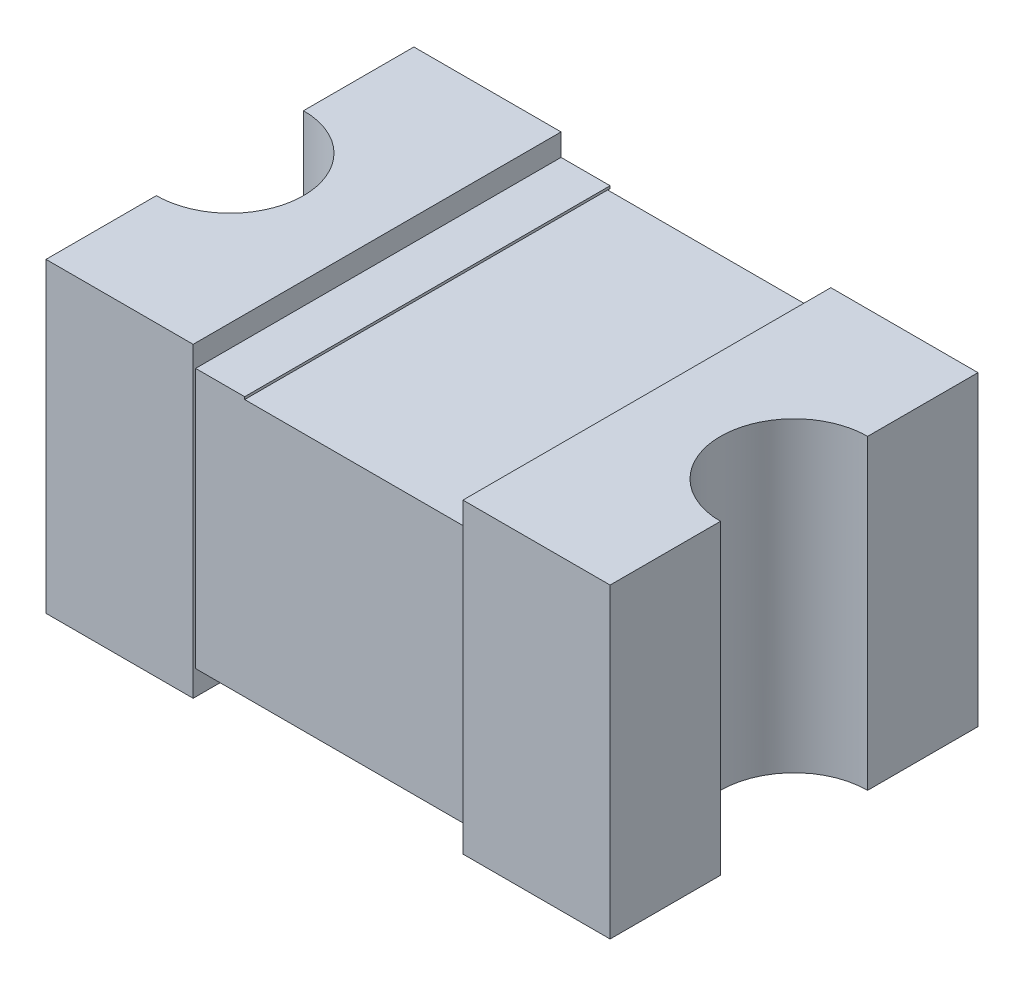
ISO-10303-21;
HEADER;
FILE_DESCRIPTION(('STEP AP214'),'2;1');
FILE_NAME('part.step','',(''),(''),'','','');
FILE_SCHEMA(('AUTOMOTIVE_DESIGN { 1 0 10303 214 1 1 1 1 }'));
ENDSEC;
DATA;
#1=APPLICATION_CONTEXT('core data for automotive mechanical design processes');
#2=APPLICATION_PROTOCOL_DEFINITION('international standard','automotive_design',2000,#1);
#3=PRODUCT_CONTEXT('',#1,'mechanical');
#4=PRODUCT('Part','Part','',(#3));
#5=PRODUCT_RELATED_PRODUCT_CATEGORY('part','',(#4));
#6=PRODUCT_DEFINITION_FORMATION('','',#4);
#7=PRODUCT_DEFINITION_CONTEXT('part definition',#1,'design');
#8=PRODUCT_DEFINITION('design','',#6,#7);
#9=PRODUCT_DEFINITION_SHAPE('','',#8);
#10=(LENGTH_UNIT() NAMED_UNIT(*) SI_UNIT(.MILLI.,.METRE.));
#11=(NAMED_UNIT(*) PLANE_ANGLE_UNIT() SI_UNIT($,.RADIAN.));
#12=(NAMED_UNIT(*) SI_UNIT($,.STERADIAN.) SOLID_ANGLE_UNIT());
#13=UNCERTAINTY_MEASURE_WITH_UNIT(LENGTH_MEASURE(1.E-05),#10,'distance_accuracy_value','');
#14=(GEOMETRIC_REPRESENTATION_CONTEXT(3) GLOBAL_UNCERTAINTY_ASSIGNED_CONTEXT((#13)) GLOBAL_UNIT_ASSIGNED_CONTEXT((#10,
#11,#12)) REPRESENTATION_CONTEXT('',''));
#15=CARTESIAN_POINT('',(0.,0.,0.));
#16=DIRECTION('',(0.,0.,1.));
#17=DIRECTION('',(1.,0.,0.));
#18=AXIS2_PLACEMENT_3D('',#15,#16,#17);
#19=CARTESIAN_POINT('',(-1.15,1.25,-0.75));
#20=DIRECTION('',(1.,0.,0.));
#21=DIRECTION('',(0.,0.,-1.));
#22=AXIS2_PLACEMENT_3D('',#19,#20,#21);
#23=PLANE('',#22);
#24=DIRECTION('',(0.,1.,0.));
#25=VECTOR('',#24,1.);
#26=CARTESIAN_POINT('',(-1.15,0.,-0.3));
#27=LINE('',#26,#25);
#28=CARTESIAN_POINT('',(-1.15,0.,-0.3));
#29=VERTEX_POINT('',#28);
#30=CARTESIAN_POINT('',(-1.15,1.25,-0.3));
#31=VERTEX_POINT('',#30);
#32=EDGE_CURVE('E152',#29,#31,#27,.T.);
#33=ORIENTED_EDGE('',*,*,#32,.T.);
#34=DIRECTION('',(0.,0.,1.));
#35=VECTOR('',#34,1.);
#36=CARTESIAN_POINT('',(-1.15,1.25,0.75));
#37=LINE('',#36,#35);
#38=CARTESIAN_POINT('',(-1.15,1.25,-0.75));
#39=VERTEX_POINT('',#38);
#40=EDGE_CURVE('E155',#39,#31,#37,.T.);
#41=ORIENTED_EDGE('',*,*,#40,.F.);
#42=DIRECTION('',(0.,1.,0.));
#43=VECTOR('',#42,1.);
#44=CARTESIAN_POINT('',(-1.15,1.25,-0.75));
#45=LINE('',#44,#43);
#46=CARTESIAN_POINT('',(-1.15,0.,-0.75));
#47=VERTEX_POINT('',#46);
#48=EDGE_CURVE('E420',#39,#47,#45,.F.);
#49=ORIENTED_EDGE('',*,*,#48,.T.);
#50=DIRECTION('',(0.,0.,1.));
#51=VECTOR('',#50,1.);
#52=CARTESIAN_POINT('',(-1.15,0.,0.75));
#53=LINE('',#52,#51);
#54=EDGE_CURVE('E158',#47,#29,#53,.T.);
#55=ORIENTED_EDGE('',*,*,#54,.T.);
#56=EDGE_LOOP('',(#33,#41,#49,#55));
#57=FACE_BOUND('',#56,.T.);
#58=ADVANCED_FACE('F17',(#57),#23,.F.);
#59=CARTESIAN_POINT('',(-1.15,0.,0.));
#60=DIRECTION('',(0.,1.,0.));
#61=DIRECTION('',(0.,0.,1.));
#62=AXIS2_PLACEMENT_3D('',#59,#60,#61);
#63=CYLINDRICAL_SURFACE('',#62,0.3);
#64=ORIENTED_EDGE('',*,*,#32,.F.);
#65=CARTESIAN_POINT('',(-1.15,0.,0.));
#66=DIRECTION('',(0.,-1.,0.));
#67=DIRECTION('',(0.,0.,-1.));
#68=AXIS2_PLACEMENT_3D('',#65,#66,#67);
#69=CIRCLE('',#68,0.3);
#70=CARTESIAN_POINT('',(-1.15,0.,0.3));
#71=VERTEX_POINT('',#70);
#72=EDGE_CURVE('E190',#29,#71,#69,.T.);
#73=ORIENTED_EDGE('',*,*,#72,.T.);
#74=DIRECTION('',(0.,1.,0.));
#75=VECTOR('',#74,1.);
#76=CARTESIAN_POINT('',(-1.15,1.25,0.3));
#77=LINE('',#76,#75);
#78=CARTESIAN_POINT('',(-1.15,1.25,0.3));
#79=VERTEX_POINT('',#78);
#80=EDGE_CURVE('E161',#71,#79,#77,.T.);
#81=ORIENTED_EDGE('',*,*,#80,.T.);
#82=CARTESIAN_POINT('',(-1.15,1.25,-0.3));
#83=CARTESIAN_POINT('',(-1.09304555927541,1.25,-0.3));
#84=CARTESIAN_POINT('',(-1.03957158713144,1.25,-0.27893649031873));
#85=CARTESIAN_POINT('',(-0.982253929764885,1.25,-0.25635894497391));
#86=CARTESIAN_POINT('',(-0.937867965644035,1.25,-0.212132034355964));
#87=CARTESIAN_POINT('',(-0.894228528229855,1.25,-0.168648975326774));
#88=CARTESIAN_POINT('',(-0.87106350968127,1.25,-0.110428412868562));
#89=CARTESIAN_POINT('',(-0.85010215683156,1.25,-0.057746315928485));
#90=CARTESIAN_POINT('',(-0.85,1.25,0.));
#91=CARTESIAN_POINT('',(-0.84989969452912,1.25,0.056699795034654));
#92=CARTESIAN_POINT('',(-0.87106350968127,1.25,0.110428412868562));
#93=CARTESIAN_POINT('',(-0.89364105502611,1.25,0.167746070235134));
#94=CARTESIAN_POINT('',(-0.937867965644035,1.25,0.212132034355964));
#95=CARTESIAN_POINT('',(-0.981351024673235,1.25,0.255771471770153));
#96=CARTESIAN_POINT('',(-1.03957158713144,1.25,0.278936490318729));
#97=CARTESIAN_POINT('',(-1.0925104344894,1.25,0.3));
#98=CARTESIAN_POINT('',(-1.15,1.25,0.3));
#99=B_SPLINE_CURVE_WITH_KNOTS('',2,(#82,#83,#84,#85,#86,#87,#88,#89,#90,#91,#92,#93,#94,#95,#96,
#97,#98),.UNSPECIFIED.,.F.,.F.,(3,2,2,2,2,2,2,2,3),(0.,0.125,0.25,0.375,0.5,0.625,0.75,0.875,
1.),.UNSPECIFIED.);
#100=EDGE_CURVE('E164',#31,#79,#99,.T.);
#101=ORIENTED_EDGE('',*,*,#100,.F.);
#102=EDGE_LOOP('',(#64,#73,#81,#101));
#103=FACE_BOUND('',#102,.T.);
#104=ADVANCED_FACE('F166',(#103),#63,.F.);
#105=CARTESIAN_POINT('',(-1.15,1.25,-0.75));
#106=DIRECTION('',(1.,0.,0.));
#107=DIRECTION('',(0.,0.,-1.));
#108=AXIS2_PLACEMENT_3D('',#105,#106,#107);
#109=PLANE('',#108);
#110=ORIENTED_EDGE('',*,*,#80,.F.);
#111=DIRECTION('',(0.,0.,1.));
#112=VECTOR('',#111,1.);
#113=CARTESIAN_POINT('',(-1.15,0.,0.75));
#114=LINE('',#113,#112);
#115=CARTESIAN_POINT('',(-1.15,0.,0.75));
#116=VERTEX_POINT('',#115);
#117=EDGE_CURVE('E195',#71,#116,#114,.T.);
#118=ORIENTED_EDGE('',*,*,#117,.T.);
#119=DIRECTION('',(0.,1.,0.));
#120=VECTOR('',#119,1.);
#121=CARTESIAN_POINT('',(-1.15,1.25,0.75));
#122=LINE('',#121,#120);
#123=CARTESIAN_POINT('',(-1.15,1.25,0.75));
#124=VERTEX_POINT('',#123);
#125=EDGE_CURVE('E280',#116,#124,#122,.T.);
#126=ORIENTED_EDGE('',*,*,#125,.T.);
#127=DIRECTION('',(0.,0.,1.));
#128=VECTOR('',#127,1.);
#129=CARTESIAN_POINT('',(-1.15,1.25,0.75));
#130=LINE('',#129,#128);
#131=EDGE_CURVE('E172',#79,#124,#130,.T.);
#132=ORIENTED_EDGE('',*,*,#131,.F.);
#133=EDGE_LOOP('',(#110,#118,#126,#132));
#134=FACE_BOUND('',#133,.T.);
#135=ADVANCED_FACE('F233',(#134),#109,.F.);
#136=CARTESIAN_POINT('',(1.15,0.,0.));
#137=DIRECTION('',(0.,1.,0.));
#138=DIRECTION('',(0.,0.,1.));
#139=AXIS2_PLACEMENT_3D('',#136,#137,#138);
#140=CYLINDRICAL_SURFACE('',#139,0.3);
#141=DIRECTION('',(0.,1.,0.));
#142=VECTOR('',#141,1.);
#143=CARTESIAN_POINT('',(1.15,1.25,0.3));
#144=LINE('',#143,#142);
#145=CARTESIAN_POINT('',(1.15,1.25,0.3));
#146=VERTEX_POINT('',#145);
#147=CARTESIAN_POINT('',(1.15,0.,0.3));
#148=VERTEX_POINT('',#147);
#149=EDGE_CURVE('E431',#146,#148,#144,.F.);
#150=ORIENTED_EDGE('',*,*,#149,.T.);
#151=CARTESIAN_POINT('',(1.15,0.,0.));
#152=DIRECTION('',(0.,-1.,0.));
#153=DIRECTION('',(0.,0.,1.));
#154=AXIS2_PLACEMENT_3D('',#151,#152,#153);
#155=CIRCLE('',#154,0.3);
#156=CARTESIAN_POINT('',(1.15,0.,-0.3));
#157=VERTEX_POINT('',#156);
#158=EDGE_CURVE('E372',#148,#157,#155,.T.);
#159=ORIENTED_EDGE('',*,*,#158,.T.);
#160=DIRECTION('',(0.,1.,0.));
#161=VECTOR('',#160,1.);
#162=CARTESIAN_POINT('',(1.15,1.25,-0.3));
#163=LINE('',#162,#161);
#164=CARTESIAN_POINT('',(1.15,1.25,-0.3));
#165=VERTEX_POINT('',#164);
#166=EDGE_CURVE('E271',#157,#165,#163,.T.);
#167=ORIENTED_EDGE('',*,*,#166,.T.);
#168=CARTESIAN_POINT('',(1.15,1.25,0.3));
#169=CARTESIAN_POINT('',(1.09304555927543,1.25,0.3));
#170=CARTESIAN_POINT('',(1.03957158713144,1.25,0.278936490318729));
#171=CARTESIAN_POINT('',(0.982253929764905,1.25,0.256358944973925));
#172=CARTESIAN_POINT('',(0.937867965644036,1.25,0.212132034355964));
#173=CARTESIAN_POINT('',(0.894228528229861,1.25,0.168648975326785));
#174=CARTESIAN_POINT('',(0.871063509681271,1.25,0.110428412868562));
#175=CARTESIAN_POINT('',(0.850102156831565,1.25,0.0577463159284991));
#176=CARTESIAN_POINT('',(0.85,1.25,0.));
#177=CARTESIAN_POINT('',(0.849899694529114,1.25,-0.056699795034609));
#178=CARTESIAN_POINT('',(0.871063509681271,1.25,-0.110428412868562));
#179=CARTESIAN_POINT('',(0.893641055026078,1.25,-0.167746070235092));
#180=CARTESIAN_POINT('',(0.937867965644036,1.25,-0.212132034355964));
#181=CARTESIAN_POINT('',(0.981351024673213,1.25,-0.255771471770144));
#182=CARTESIAN_POINT('',(1.03957158713144,1.25,-0.27893649031873));
#183=CARTESIAN_POINT('',(1.0925104344894,1.25,-0.3));
#184=CARTESIAN_POINT('',(1.15,1.25,-0.3));
#185=B_SPLINE_CURVE_WITH_KNOTS('',2,(#168,#169,#170,#171,#172,#173,#174,#175,#176,#177,#178,
#179,#180,#181,#182,#183,#184),.UNSPECIFIED.,.F.,.F.,(3,2,2,2,2,2,2,2,3),(0.,0.125,0.25,0.375,
0.5,0.625,0.75,0.875,1.),.UNSPECIFIED.);
#186=EDGE_CURVE('E358',#146,#165,#185,.T.);
#187=ORIENTED_EDGE('',*,*,#186,.F.);
#188=EDGE_LOOP('',(#150,#159,#167,#187));
#189=FACE_BOUND('',#188,.T.);
#190=ADVANCED_FACE('F228',(#189),#140,.F.);
#191=CARTESIAN_POINT('',(1.15,1.25,-0.75));
#192=DIRECTION('',(-1.,0.,0.));
#193=DIRECTION('',(0.,0.,1.));
#194=AXIS2_PLACEMENT_3D('',#191,#192,#193);
#195=PLANE('',#194);
#196=ORIENTED_EDGE('',*,*,#166,.F.);
#197=DIRECTION('',(0.,0.,1.));
#198=VECTOR('',#197,1.);
#199=CARTESIAN_POINT('',(1.15,0.,0.75));
#200=LINE('',#199,#198);
#201=CARTESIAN_POINT('',(1.15,0.,-0.75));
#202=VERTEX_POINT('',#201);
#203=EDGE_CURVE('E376',#157,#202,#200,.F.);
#204=ORIENTED_EDGE('',*,*,#203,.T.);
#205=DIRECTION('',(0.,1.,0.));
#206=VECTOR('',#205,1.);
#207=CARTESIAN_POINT('',(1.15,1.25,-0.75));
#208=LINE('',#207,#206);
#209=CARTESIAN_POINT('',(1.15,1.25,-0.75));
#210=VERTEX_POINT('',#209);
#211=EDGE_CURVE('E442',#202,#210,#208,.T.);
#212=ORIENTED_EDGE('',*,*,#211,.T.);
#213=DIRECTION('',(0.,0.,1.));
#214=VECTOR('',#213,1.);
#215=CARTESIAN_POINT('',(1.15,1.25,0.75));
#216=LINE('',#215,#214);
#217=EDGE_CURVE('E349',#165,#210,#216,.F.);
#218=ORIENTED_EDGE('',*,*,#217,.F.);
#219=EDGE_LOOP('',(#196,#204,#212,#218));
#220=FACE_BOUND('',#219,.T.);
#221=ADVANCED_FACE('F224',(#220),#195,.F.);
#222=CARTESIAN_POINT('',(1.15,1.25,-0.75));
#223=DIRECTION('',(-1.,0.,0.));
#224=DIRECTION('',(0.,0.,1.));
#225=AXIS2_PLACEMENT_3D('',#222,#223,#224);
#226=PLANE('',#225);
#227=ORIENTED_EDGE('',*,*,#149,.F.);
#228=DIRECTION('',(0.,0.,1.));
#229=VECTOR('',#228,1.);
#230=CARTESIAN_POINT('',(1.15,1.25,0.75));
#231=LINE('',#230,#229);
#232=CARTESIAN_POINT('',(1.15,1.25,0.75));
#233=VERTEX_POINT('',#232);
#234=EDGE_CURVE('E361',#233,#146,#231,.F.);
#235=ORIENTED_EDGE('',*,*,#234,.F.);
#236=DIRECTION('',(0.,1.,0.));
#237=VECTOR('',#236,1.);
#238=CARTESIAN_POINT('',(1.15,1.25,0.75));
#239=LINE('',#238,#237);
#240=CARTESIAN_POINT('',(1.15,0.,0.75));
#241=VERTEX_POINT('',#240);
#242=EDGE_CURVE('E255',#233,#241,#239,.F.);
#243=ORIENTED_EDGE('',*,*,#242,.T.);
#244=DIRECTION('',(0.,0.,1.));
#245=VECTOR('',#244,1.);
#246=CARTESIAN_POINT('',(1.15,0.,0.75));
#247=LINE('',#246,#245);
#248=EDGE_CURVE('E452',#241,#148,#247,.F.);
#249=ORIENTED_EDGE('',*,*,#248,.T.);
#250=EDGE_LOOP('',(#227,#235,#243,#249));
#251=FACE_BOUND('',#250,.T.);
#252=ADVANCED_FACE('F220',(#251),#226,.F.);
#253=CARTESIAN_POINT('',(-0.35,1.15,-0.75));
#254=DIRECTION('',(-1.,0.,0.));
#255=DIRECTION('',(0.,0.,1.));
#256=AXIS2_PLACEMENT_3D('',#253,#254,#255);
#257=PLANE('',#256);
#258=DIRECTION('',(0.,0.,-1.));
#259=VECTOR('',#258,1.);
#260=CARTESIAN_POINT('',(-0.35,1.15,0.75));
#261=LINE('',#260,#259);
#262=CARTESIAN_POINT('',(-0.35,1.15,0.74));
#263=VERTEX_POINT('',#262);
#264=CARTESIAN_POINT('',(-0.35,1.15,-0.74));
#265=VERTEX_POINT('',#264);
#266=EDGE_CURVE('E254',#263,#265,#261,.T.);
#267=ORIENTED_EDGE('',*,*,#266,.T.);
#268=DIRECTION('',(0.,0.,1.));
#269=VECTOR('',#268,1.);
#270=CARTESIAN_POINT('',(-0.35,1.15,-0.74));
#271=LINE('',#270,#269);
#272=CARTESIAN_POINT('',(-0.35,1.15,-0.75));
#273=VERTEX_POINT('',#272);
#274=EDGE_CURVE('E261',#265,#273,#271,.F.);
#275=ORIENTED_EDGE('',*,*,#274,.T.);
#276=DIRECTION('',(0.,1.,0.));
#277=VECTOR('',#276,1.);
#278=CARTESIAN_POINT('',(-0.35,1.25,-0.75));
#279=LINE('',#278,#277);
#280=CARTESIAN_POINT('',(-0.35,1.16,-0.75));
#281=VERTEX_POINT('',#280);
#282=EDGE_CURVE('E264',#273,#281,#279,.T.);
#283=ORIENTED_EDGE('',*,*,#282,.T.);
#284=DIRECTION('',(0.,0.,1.));
#285=VECTOR('',#284,1.);
#286=CARTESIAN_POINT('',(-0.35,1.16,0.75));
#287=LINE('',#286,#285);
#288=CARTESIAN_POINT('',(-0.35,1.16,0.74));
#289=VERTEX_POINT('',#288);
#290=EDGE_CURVE('E267',#289,#281,#287,.F.);
#291=ORIENTED_EDGE('',*,*,#290,.F.);
#292=DIRECTION('',(0.,1.,0.));
#293=VECTOR('',#292,1.);
#294=CARTESIAN_POINT('',(-0.35,1.15,0.74));
#295=LINE('',#294,#293);
#296=EDGE_CURVE('E410',#263,#289,#295,.T.);
#297=ORIENTED_EDGE('',*,*,#296,.F.);
#298=EDGE_LOOP('',(#267,#275,#283,#291,#297));
#299=FACE_BOUND('',#298,.T.);
#300=ADVANCED_FACE('F216',(#299),#257,.F.);
#301=CARTESIAN_POINT('',(-0.55,1.16,0.75));
#302=DIRECTION('',(0.,1.,0.));
#303=DIRECTION('',(0.,0.,1.));
#304=AXIS2_PLACEMENT_3D('',#301,#302,#303);
#305=PLANE('',#304);
#306=ORIENTED_EDGE('',*,*,#290,.T.);
#307=DIRECTION('',(1.,0.,0.));
#308=VECTOR('',#307,1.);
#309=CARTESIAN_POINT('',(-1.15,1.16,-0.75));
#310=LINE('',#309,#308);
#311=CARTESIAN_POINT('',(-0.55,1.16,-0.75));
#312=VERTEX_POINT('',#311);
#313=EDGE_CURVE('E266',#281,#312,#310,.F.);
#314=ORIENTED_EDGE('',*,*,#313,.T.);
#315=DIRECTION('',(0.,0.,1.));
#316=VECTOR('',#315,1.);
#317=CARTESIAN_POINT('',(-0.55,1.16,-0.75));
#318=LINE('',#317,#316);
#319=CARTESIAN_POINT('',(-0.55,1.16,0.74));
#320=VERTEX_POINT('',#319);
#321=EDGE_CURVE('E416',#312,#320,#318,.T.);
#322=ORIENTED_EDGE('',*,*,#321,.T.);
#323=DIRECTION('',(1.,0.,0.));
#324=VECTOR('',#323,1.);
#325=CARTESIAN_POINT('',(-0.55,1.16,0.74));
#326=LINE('',#325,#324);
#327=EDGE_CURVE('E407',#320,#289,#326,.T.);
#328=ORIENTED_EDGE('',*,*,#327,.T.);
#329=EDGE_LOOP('',(#306,#314,#322,#328));
#330=FACE_BOUND('',#329,.T.);
#331=ADVANCED_FACE('F212',(#330),#305,.T.);
#332=CARTESIAN_POINT('',(-1.15,1.25,-0.75));
#333=DIRECTION('',(0.,0.,1.));
#334=DIRECTION('',(1.,0.,0.));
#335=AXIS2_PLACEMENT_3D('',#332,#333,#334);
#336=PLANE('',#335);
#337=DIRECTION('',(0.,1.,0.));
#338=VECTOR('',#337,1.);
#339=CARTESIAN_POINT('',(-0.55,1.16,-0.75));
#340=LINE('',#339,#338);
#341=CARTESIAN_POINT('',(-0.55013935855,0.1,-0.75));
#342=VERTEX_POINT('',#341);
#343=CARTESIAN_POINT('',(-0.55,0.,-0.75));
#344=VERTEX_POINT('',#343);
#345=EDGE_CURVE('E300',#342,#344,#340,.F.);
#346=ORIENTED_EDGE('',*,*,#345,.T.);
#347=DIRECTION('',(1.,0.,0.));
#348=VECTOR('',#347,1.);
#349=CARTESIAN_POINT('',(1.15,0.,-0.75));
#350=LINE('',#349,#348);
#351=EDGE_CURVE('E281',#344,#47,#350,.F.);
#352=ORIENTED_EDGE('',*,*,#351,.T.);
#353=ORIENTED_EDGE('',*,*,#48,.F.);
#354=DIRECTION('',(1.,0.,0.));
#355=VECTOR('',#354,1.);
#356=CARTESIAN_POINT('',(1.15,1.25,-0.75));
#357=LINE('',#356,#355);
#358=CARTESIAN_POINT('',(-0.55,1.25,-0.75));
#359=VERTEX_POINT('',#358);
#360=EDGE_CURVE('E177',#359,#39,#357,.F.);
#361=ORIENTED_EDGE('',*,*,#360,.F.);
#362=DIRECTION('',(0.,1.,0.));
#363=VECTOR('',#362,1.);
#364=CARTESIAN_POINT('',(-0.55,1.16,-0.75));
#365=LINE('',#364,#363);
#366=EDGE_CURVE('E413',#359,#312,#365,.F.);
#367=ORIENTED_EDGE('',*,*,#366,.T.);
#368=ORIENTED_EDGE('',*,*,#313,.F.);
#369=ORIENTED_EDGE('',*,*,#282,.F.);
#370=DIRECTION('',(-1.,0.,0.));
#371=VECTOR('',#370,1.);
#372=CARTESIAN_POINT('',(-0.5502787171,1.15,-0.75));
#373=LINE('',#372,#371);
#374=CARTESIAN_POINT('',(-0.5502787171,1.15,-0.75));
#375=VERTEX_POINT('',#374);
#376=EDGE_CURVE('E258',#273,#375,#373,.T.);
#377=ORIENTED_EDGE('',*,*,#376,.T.);
#378=DIRECTION('',(0.,1.,0.));
#379=VECTOR('',#378,1.);
#380=CARTESIAN_POINT('',(-0.5502787171,0.1,-0.75));
#381=LINE('',#380,#379);
#382=EDGE_CURVE('E277',#375,#342,#381,.F.);
#383=ORIENTED_EDGE('',*,*,#382,.T.);
#384=EDGE_LOOP('',(#346,#352,#353,#361,#367,#368,#369,#377,#383));
#385=FACE_BOUND('',#384,.T.);
#386=ADVANCED_FACE('F208',(#385),#336,.F.);
#387=CARTESIAN_POINT('',(1.15,0.,0.75));
#388=DIRECTION('',(0.,1.,0.));
#389=DIRECTION('',(0.,0.,1.));
#390=AXIS2_PLACEMENT_3D('',#387,#388,#389);
#391=PLANE('',#390);
#392=DIRECTION('',(0.,0.,1.));
#393=VECTOR('',#392,1.);
#394=CARTESIAN_POINT('',(-0.55,0.,-0.75));
#395=LINE('',#394,#393);
#396=CARTESIAN_POINT('',(-0.55,0.,0.75));
#397=VERTEX_POINT('',#396);
#398=EDGE_CURVE('E297',#344,#397,#395,.T.);
#399=ORIENTED_EDGE('',*,*,#398,.T.);
#400=DIRECTION('',(-1.,0.,0.));
#401=VECTOR('',#400,1.);
#402=CARTESIAN_POINT('',(-1.15,0.,0.75));
#403=LINE('',#402,#401);
#404=EDGE_CURVE('E179',#397,#116,#403,.T.);
#405=ORIENTED_EDGE('',*,*,#404,.T.);
#406=ORIENTED_EDGE('',*,*,#117,.F.);
#407=ORIENTED_EDGE('',*,*,#72,.F.);
#408=ORIENTED_EDGE('',*,*,#54,.F.);
#409=ORIENTED_EDGE('',*,*,#351,.F.);
#410=EDGE_LOOP('',(#399,#405,#406,#407,#408,#409));
#411=FACE_BOUND('',#410,.T.);
#412=ADVANCED_FACE('F197',(#411),#391,.F.);
#413=CARTESIAN_POINT('',(-1.15,1.25,0.75));
#414=DIRECTION('',(0.,0.,-1.));
#415=DIRECTION('',(-1.,0.,0.));
#416=AXIS2_PLACEMENT_3D('',#413,#414,#415);
#417=PLANE('',#416);
#418=DIRECTION('',(0.,1.,0.));
#419=VECTOR('',#418,1.);
#420=CARTESIAN_POINT('',(-0.55,1.16,0.75));
#421=LINE('',#420,#419);
#422=CARTESIAN_POINT('',(-0.55,1.25,0.75));
#423=VERTEX_POINT('',#422);
#424=EDGE_CURVE('E299',#397,#423,#421,.T.);
#425=ORIENTED_EDGE('',*,*,#424,.T.);
#426=DIRECTION('',(1.,0.,0.));
#427=VECTOR('',#426,1.);
#428=CARTESIAN_POINT('',(1.15,1.25,0.75));
#429=LINE('',#428,#427);
#430=EDGE_CURVE('E274',#124,#423,#429,.T.);
#431=ORIENTED_EDGE('',*,*,#430,.F.);
#432=ORIENTED_EDGE('',*,*,#125,.F.);
#433=ORIENTED_EDGE('',*,*,#404,.F.);
#434=EDGE_LOOP('',(#425,#431,#432,#433));
#435=FACE_BOUND('',#434,.T.);
#436=ADVANCED_FACE('F207',(#435),#417,.F.);
#437=CARTESIAN_POINT('',(1.15,1.25,0.75));
#438=DIRECTION('',(0.,1.,0.));
#439=DIRECTION('',(0.,0.,1.));
#440=AXIS2_PLACEMENT_3D('',#437,#438,#439);
#441=PLANE('',#440);
#442=ORIENTED_EDGE('',*,*,#131,.T.);
#443=ORIENTED_EDGE('',*,*,#430,.T.);
#444=DIRECTION('',(0.,0.,1.));
#445=VECTOR('',#444,1.);
#446=CARTESIAN_POINT('',(-0.55,1.25,-0.75));
#447=LINE('',#446,#445);
#448=EDGE_CURVE('E423',#423,#359,#447,.F.);
#449=ORIENTED_EDGE('',*,*,#448,.T.);
#450=ORIENTED_EDGE('',*,*,#360,.T.);
#451=ORIENTED_EDGE('',*,*,#40,.T.);
#452=ORIENTED_EDGE('',*,*,#100,.T.);
#453=EDGE_LOOP('',(#442,#443,#449,#450,#451,#452));
#454=FACE_BOUND('',#453,.T.);
#455=ADVANCED_FACE('F175',(#454),#441,.T.);
#456=CARTESIAN_POINT('',(-0.5502787171,0.1,-0.74));
#457=DIRECTION('',(-1.,0.,0.));
#458=DIRECTION('',(0.,0.,1.));
#459=AXIS2_PLACEMENT_3D('',#456,#457,#458);
#460=PLANE('',#459);
#461=DIRECTION('',(0.,0.,1.));
#462=VECTOR('',#461,1.);
#463=CARTESIAN_POINT('',(-0.5502787171,1.15,-0.74));
#464=LINE('',#463,#462);
#465=CARTESIAN_POINT('',(-0.5502787171,1.15,-0.74));
#466=VERTEX_POINT('',#465);
#467=EDGE_CURVE('E260',#375,#466,#464,.T.);
#468=ORIENTED_EDGE('',*,*,#467,.T.);
#469=DIRECTION('',(0.,1.,0.));
#470=VECTOR('',#469,1.);
#471=CARTESIAN_POINT('',(-0.5502787171,1.15,-0.74));
#472=LINE('',#471,#470);
#473=CARTESIAN_POINT('',(-0.55013935855,0.1,-0.74));
#474=VERTEX_POINT('',#473);
#475=EDGE_CURVE('E425',#474,#466,#472,.T.);
#476=ORIENTED_EDGE('',*,*,#475,.F.);
#477=CARTESIAN_POINT('',(-0.5502787171,0.1,-0.74));
#478=DIRECTION('',(0.,0.,-1.));
#479=VECTOR('',#478,1.);
#480=LINE('',#477,#479);
#481=EDGE_CURVE('E308',#474,#342,#480,.T.);
#482=ORIENTED_EDGE('',*,*,#481,.T.);
#483=ORIENTED_EDGE('',*,*,#382,.F.);
#484=EDGE_LOOP('',(#468,#476,#482,#483));
#485=FACE_BOUND('',#484,.T.);
#486=ADVANCED_FACE('F390',(#485),#460,.F.);
#487=CARTESIAN_POINT('',(-0.5502787171,1.15,-0.74));
#488=DIRECTION('',(0.,1.,0.));
#489=DIRECTION('',(-1.,0.,0.));
#490=AXIS2_PLACEMENT_3D('',#487,#488,#489);
#491=PLANE('',#490);
#492=ORIENTED_EDGE('',*,*,#467,.F.);
#493=ORIENTED_EDGE('',*,*,#376,.F.);
#494=ORIENTED_EDGE('',*,*,#274,.F.);
#495=DIRECTION('',(-1.,0.,0.));
#496=VECTOR('',#495,1.);
#497=CARTESIAN_POINT('',(-0.5502787171,1.15,-0.74));
#498=LINE('',#497,#496);
#499=EDGE_CURVE('E481',#466,#265,#498,.F.);
#500=ORIENTED_EDGE('',*,*,#499,.F.);
#501=EDGE_LOOP('',(#492,#493,#494,#500));
#502=FACE_BOUND('',#501,.T.);
#503=ADVANCED_FACE('F387',(#502),#491,.F.);
#504=CARTESIAN_POINT('',(1.15,0.,0.75));
#505=DIRECTION('',(0.,1.,0.));
#506=DIRECTION('',(0.,0.,1.));
#507=AXIS2_PLACEMENT_3D('',#504,#505,#506);
#508=PLANE('',#507);
#509=DIRECTION('',(0.,0.,-1.));
#510=VECTOR('',#509,1.);
#511=CARTESIAN_POINT('',(0.55,0.,-0.75));
#512=LINE('',#511,#510);
#513=CARTESIAN_POINT('',(0.55,0.,0.75));
#514=VERTEX_POINT('',#513);
#515=CARTESIAN_POINT('',(0.55,0.,-0.75));
#516=VERTEX_POINT('',#515);
#517=EDGE_CURVE('E467',#514,#516,#512,.T.);
#518=ORIENTED_EDGE('',*,*,#517,.T.);
#519=DIRECTION('',(1.,0.,0.));
#520=VECTOR('',#519,1.);
#521=CARTESIAN_POINT('',(-1.15,0.,-0.75));
#522=LINE('',#521,#520);
#523=EDGE_CURVE('E364',#516,#202,#522,.T.);
#524=ORIENTED_EDGE('',*,*,#523,.T.);
#525=ORIENTED_EDGE('',*,*,#203,.F.);
#526=ORIENTED_EDGE('',*,*,#158,.F.);
#527=ORIENTED_EDGE('',*,*,#248,.F.);
#528=DIRECTION('',(-1.,0.,0.));
#529=VECTOR('',#528,1.);
#530=CARTESIAN_POINT('',(-1.15,0.,0.75));
#531=LINE('',#530,#529);
#532=EDGE_CURVE('E247',#241,#514,#531,.T.);
#533=ORIENTED_EDGE('',*,*,#532,.T.);
#534=EDGE_LOOP('',(#518,#524,#525,#526,#527,#533));
#535=FACE_BOUND('',#534,.T.);
#536=ADVANCED_FACE('F378',(#535),#508,.F.);
#537=CARTESIAN_POINT('',(-1.15,1.25,-0.75));
#538=DIRECTION('',(0.,0.,1.));
#539=DIRECTION('',(1.,0.,0.));
#540=AXIS2_PLACEMENT_3D('',#537,#538,#539);
#541=PLANE('',#540);
#542=DIRECTION('',(0.,1.,0.));
#543=VECTOR('',#542,1.);
#544=CARTESIAN_POINT('',(0.55,1.15,-0.75));
#545=LINE('',#544,#543);
#546=CARTESIAN_POINT('',(0.55,1.25,-0.75));
#547=VERTEX_POINT('',#546);
#548=EDGE_CURVE('E598',#516,#547,#545,.T.);
#549=ORIENTED_EDGE('',*,*,#548,.T.);
#550=DIRECTION('',(1.,0.,0.));
#551=VECTOR('',#550,1.);
#552=CARTESIAN_POINT('',(1.15,1.25,-0.75));
#553=LINE('',#552,#551);
#554=EDGE_CURVE('E357',#210,#547,#553,.F.);
#555=ORIENTED_EDGE('',*,*,#554,.F.);
#556=ORIENTED_EDGE('',*,*,#211,.F.);
#557=ORIENTED_EDGE('',*,*,#523,.F.);
#558=EDGE_LOOP('',(#549,#555,#556,#557));
#559=FACE_BOUND('',#558,.T.);
#560=ADVANCED_FACE('F339',(#559),#541,.F.);
#561=CARTESIAN_POINT('',(1.15,1.25,0.75));
#562=DIRECTION('',(0.,1.,0.));
#563=DIRECTION('',(0.,0.,1.));
#564=AXIS2_PLACEMENT_3D('',#561,#562,#563);
#565=PLANE('',#564);
#566=ORIENTED_EDGE('',*,*,#217,.T.);
#567=ORIENTED_EDGE('',*,*,#554,.T.);
#568=DIRECTION('',(0.,0.,-1.));
#569=VECTOR('',#568,1.);
#570=CARTESIAN_POINT('',(0.55,1.25,-0.75));
#571=LINE('',#570,#569);
#572=CARTESIAN_POINT('',(0.55,1.25,0.75));
#573=VERTEX_POINT('',#572);
#574=EDGE_CURVE('E594',#547,#573,#571,.F.);
#575=ORIENTED_EDGE('',*,*,#574,.T.);
#576=DIRECTION('',(-1.,0.,0.));
#577=VECTOR('',#576,1.);
#578=CARTESIAN_POINT('',(-1.15,1.25,0.75));
#579=LINE('',#578,#577);
#580=EDGE_CURVE('E439',#573,#233,#579,.F.);
#581=ORIENTED_EDGE('',*,*,#580,.T.);
#582=ORIENTED_EDGE('',*,*,#234,.T.);
#583=ORIENTED_EDGE('',*,*,#186,.T.);
#584=EDGE_LOOP('',(#566,#567,#575,#581,#582,#583));
#585=FACE_BOUND('',#584,.T.);
#586=ADVANCED_FACE('F334',(#585),#565,.T.);
#587=CARTESIAN_POINT('',(-1.15,1.25,0.75));
#588=DIRECTION('',(0.,0.,-1.));
#589=DIRECTION('',(-1.,0.,0.));
#590=AXIS2_PLACEMENT_3D('',#587,#588,#589);
#591=PLANE('',#590);
#592=ORIENTED_EDGE('',*,*,#532,.F.);
#593=ORIENTED_EDGE('',*,*,#242,.F.);
#594=ORIENTED_EDGE('',*,*,#580,.F.);
#595=DIRECTION('',(0.,1.,0.));
#596=VECTOR('',#595,1.);
#597=CARTESIAN_POINT('',(0.55,1.15,0.75));
#598=LINE('',#597,#596);
#599=EDGE_CURVE('E529',#573,#514,#598,.F.);
#600=ORIENTED_EDGE('',*,*,#599,.T.);
#601=EDGE_LOOP('',(#592,#593,#594,#600));
#602=FACE_BOUND('',#601,.T.);
#603=ADVANCED_FACE('F330',(#602),#591,.F.);
#604=CARTESIAN_POINT('',(0.55,1.15,0.75));
#605=DIRECTION('',(0.,-1.,0.));
#606=DIRECTION('',(0.,0.,-1.));
#607=AXIS2_PLACEMENT_3D('',#604,#605,#606);
#608=PLANE('',#607);
#609=ORIENTED_EDGE('',*,*,#266,.F.);
#610=DIRECTION('',(1.,0.,0.));
#611=VECTOR('',#610,1.);
#612=CARTESIAN_POINT('',(-0.55,1.15,0.74));
#613=LINE('',#612,#611);
#614=CARTESIAN_POINT('',(0.55,1.15,0.74));
#615=VERTEX_POINT('',#614);
#616=EDGE_CURVE('E488',#615,#263,#613,.F.);
#617=ORIENTED_EDGE('',*,*,#616,.F.);
#618=DIRECTION('',(0.,0.,-1.));
#619=VECTOR('',#618,1.);
#620=CARTESIAN_POINT('',(0.55,1.15,-0.75));
#621=LINE('',#620,#619);
#622=CARTESIAN_POINT('',(0.55,1.15,-0.74));
#623=VERTEX_POINT('',#622);
#624=EDGE_CURVE('E480',#615,#623,#621,.T.);
#625=ORIENTED_EDGE('',*,*,#624,.T.);
#626=DIRECTION('',(-1.,0.,0.));
#627=VECTOR('',#626,1.);
#628=CARTESIAN_POINT('',(-0.5502787171,1.15,-0.74));
#629=LINE('',#628,#627);
#630=EDGE_CURVE('E477',#265,#623,#629,.F.);
#631=ORIENTED_EDGE('',*,*,#630,.F.);
#632=EDGE_LOOP('',(#609,#617,#625,#631));
#633=FACE_BOUND('',#632,.T.);
#634=ADVANCED_FACE('F326',(#633),#608,.F.);
#635=CARTESIAN_POINT('',(-0.55,1.16,-0.75));
#636=DIRECTION('',(-1.,0.,0.));
#637=DIRECTION('',(0.,0.,1.));
#638=AXIS2_PLACEMENT_3D('',#635,#636,#637);
#639=PLANE('',#638);
#640=ORIENTED_EDGE('',*,*,#424,.F.);
#641=ORIENTED_EDGE('',*,*,#398,.F.);
#642=ORIENTED_EDGE('',*,*,#345,.F.);
#643=ORIENTED_EDGE('',*,*,#481,.F.);
#644=DIRECTION('',(0.,0.,-1.));
#645=VECTOR('',#644,1.);
#646=CARTESIAN_POINT('',(-0.55,0.1,-0.75));
#647=LINE('',#646,#645);
#648=CARTESIAN_POINT('',(-0.55,0.1,0.74));
#649=VERTEX_POINT('',#648);
#650=EDGE_CURVE('E491',#649,#474,#647,.T.);
#651=ORIENTED_EDGE('',*,*,#650,.F.);
#652=DIRECTION('',(0.,1.,0.));
#653=VECTOR('',#652,1.);
#654=CARTESIAN_POINT('',(-0.55,0.1,0.74));
#655=LINE('',#654,#653);
#656=EDGE_CURVE('E495',#320,#649,#655,.F.);
#657=ORIENTED_EDGE('',*,*,#656,.F.);
#658=ORIENTED_EDGE('',*,*,#321,.F.);
#659=ORIENTED_EDGE('',*,*,#366,.F.);
#660=ORIENTED_EDGE('',*,*,#448,.F.);
#661=EDGE_LOOP('',(#640,#641,#642,#643,#651,#657,#658,#659,#660));
#662=FACE_BOUND('',#661,.T.);
#663=ADVANCED_FACE('F315',(#662),#639,.F.);
#664=CARTESIAN_POINT('',(-0.5502787171,1.15,-0.74));
#665=DIRECTION('',(0.,0.,-1.));
#666=DIRECTION('',(-1.,0.,0.));
#667=AXIS2_PLACEMENT_3D('',#664,#665,#666);
#668=PLANE('',#667);
#669=DIRECTION('',(0.,1.,0.));
#670=VECTOR('',#669,1.);
#671=CARTESIAN_POINT('',(0.55,1.15,-0.74));
#672=LINE('',#671,#670);
#673=CARTESIAN_POINT('',(0.55,0.1,-0.74));
#674=VERTEX_POINT('',#673);
#675=EDGE_CURVE('E485',#623,#674,#672,.F.);
#676=ORIENTED_EDGE('',*,*,#675,.T.);
#677=DIRECTION('',(1.,0.,0.));
#678=VECTOR('',#677,1.);
#679=CARTESIAN_POINT('',(-0.55,0.1,-0.74));
#680=LINE('',#679,#678);
#681=EDGE_CURVE('E604',#474,#674,#680,.T.);
#682=ORIENTED_EDGE('',*,*,#681,.F.);
#683=ORIENTED_EDGE('',*,*,#475,.T.);
#684=ORIENTED_EDGE('',*,*,#499,.T.);
#685=ORIENTED_EDGE('',*,*,#630,.T.);
#686=EDGE_LOOP('',(#676,#682,#683,#684,#685));
#687=FACE_BOUND('',#686,.T.);
#688=ADVANCED_FACE('F325',(#687),#668,.T.);
#689=CARTESIAN_POINT('',(0.55,1.15,-0.75));
#690=DIRECTION('',(1.,0.,0.));
#691=DIRECTION('',(0.,0.,-1.));
#692=AXIS2_PLACEMENT_3D('',#689,#690,#691);
#693=PLANE('',#692);
#694=ORIENTED_EDGE('',*,*,#574,.F.);
#695=ORIENTED_EDGE('',*,*,#548,.F.);
#696=ORIENTED_EDGE('',*,*,#517,.F.);
#697=ORIENTED_EDGE('',*,*,#599,.F.);
#698=EDGE_LOOP('',(#694,#695,#696,#697));
#699=FACE_BOUND('',#698,.T.);
#700=ORIENTED_EDGE('',*,*,#675,.F.);
#701=ORIENTED_EDGE('',*,*,#624,.F.);
#702=DIRECTION('',(0.,1.,0.));
#703=VECTOR('',#702,1.);
#704=CARTESIAN_POINT('',(0.55,0.1,0.74));
#705=LINE('',#704,#703);
#706=CARTESIAN_POINT('',(0.55,0.1,0.74));
#707=VERTEX_POINT('',#706);
#708=EDGE_CURVE('E35',#707,#615,#705,.T.);
#709=ORIENTED_EDGE('',*,*,#708,.F.);
#710=DIRECTION('',(0.,0.,-1.));
#711=VECTOR('',#710,1.);
#712=CARTESIAN_POINT('',(0.55,0.1,-0.75));
#713=LINE('',#712,#711);
#714=EDGE_CURVE('E26',#674,#707,#713,.F.);
#715=ORIENTED_EDGE('',*,*,#714,.F.);
#716=EDGE_LOOP('',(#700,#701,#709,#715));
#717=FACE_BOUND('',#716,.T.);
#718=ADVANCED_FACE('F582',(#699,#717),#693,.F.);
#719=CARTESIAN_POINT('',(-0.55,0.1,0.74));
#720=DIRECTION('',(0.,0.,1.));
#721=DIRECTION('',(1.,0.,0.));
#722=AXIS2_PLACEMENT_3D('',#719,#720,#721);
#723=PLANE('',#722);
#724=ORIENTED_EDGE('',*,*,#708,.T.);
#725=ORIENTED_EDGE('',*,*,#616,.T.);
#726=ORIENTED_EDGE('',*,*,#296,.T.);
#727=ORIENTED_EDGE('',*,*,#327,.F.);
#728=ORIENTED_EDGE('',*,*,#656,.T.);
#729=DIRECTION('',(1.,0.,0.));
#730=VECTOR('',#729,1.);
#731=CARTESIAN_POINT('',(-0.55,0.1,0.74));
#732=LINE('',#731,#730);
#733=EDGE_CURVE('E11',#707,#649,#732,.F.);
#734=ORIENTED_EDGE('',*,*,#733,.F.);
#735=EDGE_LOOP('',(#724,#725,#726,#727,#728,#734));
#736=FACE_BOUND('',#735,.T.);
#737=ADVANCED_FACE('F576',(#736),#723,.T.);
#738=CARTESIAN_POINT('',(-0.55,0.1,-0.75));
#739=DIRECTION('',(0.,-1.,0.));
#740=DIRECTION('',(0.,0.,-1.));
#741=AXIS2_PLACEMENT_3D('',#738,#739,#740);
#742=PLANE('',#741);
#743=ORIENTED_EDGE('',*,*,#714,.T.);
#744=ORIENTED_EDGE('',*,*,#733,.T.);
#745=ORIENTED_EDGE('',*,*,#650,.T.);
#746=ORIENTED_EDGE('',*,*,#681,.T.);
#747=EDGE_LOOP('',(#743,#744,#745,#746));
#748=FACE_BOUND('',#747,.T.);
#749=ADVANCED_FACE('F574',(#748),#742,.T.);
#750=CLOSED_SHELL('',(#58,#104,#135,#190,#221,#252,#300,#331,#386,#412,#436,#455,#486,#503,#536,
#560,#586,#603,#634,#663,#688,#718,#737,#749));
#751=MANIFOLD_SOLID_BREP('B1',#750);
#752=ADVANCED_BREP_SHAPE_REPRESENTATION('',(#18,#751),#14);
#753=SHAPE_DEFINITION_REPRESENTATION(#9,#752);
ENDSEC;
END-ISO-10303-21;
